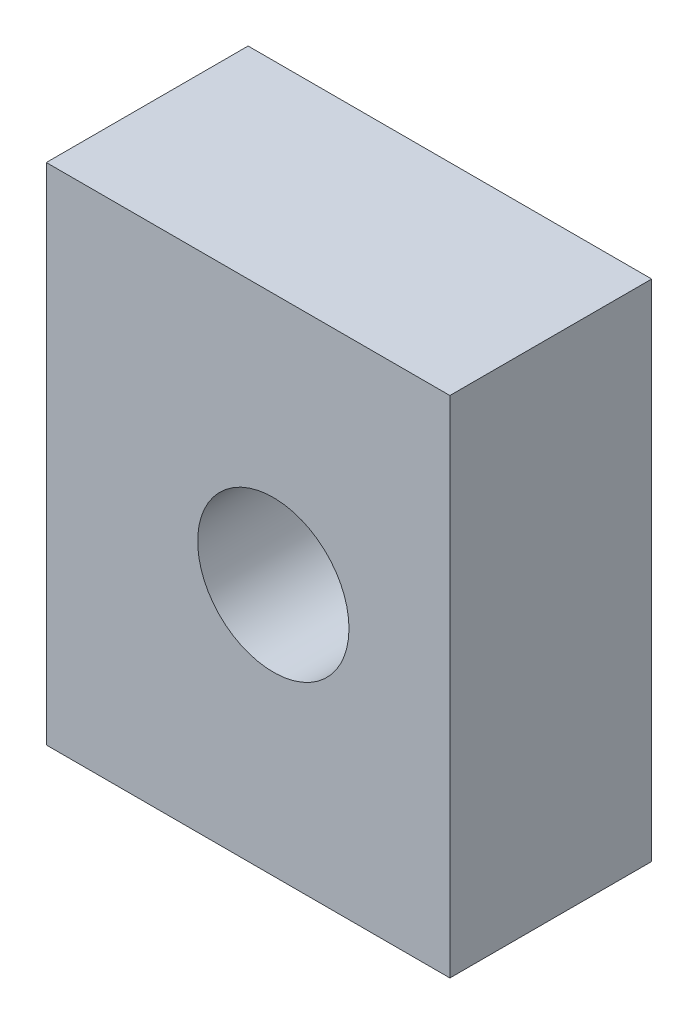
ISO-10303-21;
HEADER;
FILE_DESCRIPTION(('STEP AP214'),'2;1');
FILE_NAME('part.step','',(''),(''),'','','');
FILE_SCHEMA(('AUTOMOTIVE_DESIGN { 1 0 10303 214 1 1 1 1 }'));
ENDSEC;
DATA;
#1=APPLICATION_CONTEXT('core data for automotive mechanical design processes');
#2=APPLICATION_PROTOCOL_DEFINITION('international standard','automotive_design',2000,#1);
#3=PRODUCT_CONTEXT('',#1,'mechanical');
#4=PRODUCT('Part','Part','',(#3));
#5=PRODUCT_RELATED_PRODUCT_CATEGORY('part','',(#4));
#6=PRODUCT_DEFINITION_FORMATION('','',#4);
#7=PRODUCT_DEFINITION_CONTEXT('part definition',#1,'design');
#8=PRODUCT_DEFINITION('design','',#6,#7);
#9=PRODUCT_DEFINITION_SHAPE('','',#8);
#10=(LENGTH_UNIT() NAMED_UNIT(*) SI_UNIT(.MILLI.,.METRE.));
#11=(NAMED_UNIT(*) PLANE_ANGLE_UNIT() SI_UNIT($,.RADIAN.));
#12=(NAMED_UNIT(*) SI_UNIT($,.STERADIAN.) SOLID_ANGLE_UNIT());
#13=UNCERTAINTY_MEASURE_WITH_UNIT(LENGTH_MEASURE(1.E-05),#10,'distance_accuracy_value','');
#14=(GEOMETRIC_REPRESENTATION_CONTEXT(3) GLOBAL_UNCERTAINTY_ASSIGNED_CONTEXT((#13)) GLOBAL_UNIT_ASSIGNED_CONTEXT((#10,
#11,#12)) REPRESENTATION_CONTEXT('',''));
#15=CARTESIAN_POINT('',(0.,0.,0.));
#16=DIRECTION('',(0.,0.,1.));
#17=DIRECTION('',(1.,0.,0.));
#18=AXIS2_PLACEMENT_3D('',#15,#16,#17);
#19=CARTESIAN_POINT('',(0.,0.,4.));
#20=DIRECTION('',(0.,0.,-1.));
#21=DIRECTION('',(-1.,0.,0.));
#22=AXIS2_PLACEMENT_3D('',#19,#20,#21);
#23=PLANE('',#22);
#24=DIRECTION('',(0.,1.,0.));
#25=VECTOR('',#24,1.);
#26=CARTESIAN_POINT('',(7.99999999999996,10.,4.));
#27=LINE('',#26,#25);
#28=CARTESIAN_POINT('',(7.99999999999996,0.,4.));
#29=VERTEX_POINT('',#28);
#30=CARTESIAN_POINT('',(7.99999999999996,10.,4.));
#31=VERTEX_POINT('',#30);
#32=EDGE_CURVE('E84',#29,#31,#27,.T.);
#33=ORIENTED_EDGE('',*,*,#32,.T.);
#34=DIRECTION('',(-1.,0.,0.));
#35=VECTOR('',#34,1.);
#36=CARTESIAN_POINT('',(0.,10.,4.));
#37=LINE('',#36,#35);
#38=CARTESIAN_POINT('',(0.,10.,4.));
#39=VERTEX_POINT('',#38);
#40=EDGE_CURVE('E79',#31,#39,#37,.T.);
#41=ORIENTED_EDGE('',*,*,#40,.T.);
#42=DIRECTION('',(0.,-1.,0.));
#43=VECTOR('',#42,1.);
#44=CARTESIAN_POINT('',(0.,10.,4.));
#45=LINE('',#44,#43);
#46=CARTESIAN_POINT('',(0.,0.,4.));
#47=VERTEX_POINT('',#46);
#48=EDGE_CURVE('E82',#39,#47,#45,.T.);
#49=ORIENTED_EDGE('',*,*,#48,.T.);
#50=DIRECTION('',(1.,0.,0.));
#51=VECTOR('',#50,1.);
#52=CARTESIAN_POINT('',(7.99999999999996,0.,4.));
#53=LINE('',#52,#51);
#54=EDGE_CURVE('E49',#47,#29,#53,.T.);
#55=ORIENTED_EDGE('',*,*,#54,.T.);
#56=EDGE_LOOP('',(#33,#41,#49,#55));
#57=FACE_BOUND('',#56,.T.);
#58=CARTESIAN_POINT('',(4.49999999999998,5.,4.));
#59=DIRECTION('',(0.,0.,1.));
#60=DIRECTION('',(1.,0.,0.));
#61=AXIS2_PLACEMENT_3D('',#58,#59,#60);
#62=CIRCLE('',#61,1.5);
#63=CARTESIAN_POINT('',(5.99999999999998,5.,4.));
#64=VERTEX_POINT('',#63);
#65=EDGE_CURVE('E99',#64,#64,#62,.T.);
#66=ORIENTED_EDGE('',*,*,#65,.F.);
#67=EDGE_LOOP('',(#66));
#68=FACE_BOUND('',#67,.T.);
#69=ADVANCED_FACE('F32',(#57,#68),#23,.F.);
#70=CARTESIAN_POINT('',(0.,0.,0.));
#71=DIRECTION('',(0.,0.,-1.));
#72=DIRECTION('',(-1.,0.,0.));
#73=AXIS2_PLACEMENT_3D('',#70,#71,#72);
#74=PLANE('',#73);
#75=DIRECTION('',(0.,1.,0.));
#76=VECTOR('',#75,1.);
#77=CARTESIAN_POINT('',(7.99999999999996,10.,0.));
#78=LINE('',#77,#76);
#79=CARTESIAN_POINT('',(7.99999999999996,0.,0.));
#80=VERTEX_POINT('',#79);
#81=CARTESIAN_POINT('',(7.99999999999996,10.,0.));
#82=VERTEX_POINT('',#81);
#83=EDGE_CURVE('E96',#80,#82,#78,.T.);
#84=ORIENTED_EDGE('',*,*,#83,.F.);
#85=DIRECTION('',(1.,0.,0.));
#86=VECTOR('',#85,1.);
#87=CARTESIAN_POINT('',(7.99999999999996,0.,0.));
#88=LINE('',#87,#86);
#89=CARTESIAN_POINT('',(0.,0.,0.));
#90=VERTEX_POINT('',#89);
#91=EDGE_CURVE('E72',#90,#80,#88,.T.);
#92=ORIENTED_EDGE('',*,*,#91,.F.);
#93=DIRECTION('',(0.,-1.,0.));
#94=VECTOR('',#93,1.);
#95=CARTESIAN_POINT('',(0.,10.,0.));
#96=LINE('',#95,#94);
#97=CARTESIAN_POINT('',(0.,10.,0.));
#98=VERTEX_POINT('',#97);
#99=EDGE_CURVE('E66',#98,#90,#96,.T.);
#100=ORIENTED_EDGE('',*,*,#99,.F.);
#101=DIRECTION('',(-1.,0.,0.));
#102=VECTOR('',#101,1.);
#103=CARTESIAN_POINT('',(0.,10.,0.));
#104=LINE('',#103,#102);
#105=EDGE_CURVE('E88',#82,#98,#104,.T.);
#106=ORIENTED_EDGE('',*,*,#105,.F.);
#107=EDGE_LOOP('',(#84,#92,#100,#106));
#108=FACE_BOUND('',#107,.T.);
#109=CARTESIAN_POINT('',(4.49999999999998,5.,0.));
#110=DIRECTION('',(0.,0.,1.));
#111=DIRECTION('',(1.,0.,0.));
#112=AXIS2_PLACEMENT_3D('',#109,#110,#111);
#113=CIRCLE('',#112,1.5);
#114=CARTESIAN_POINT('',(5.99999999999998,5.,0.));
#115=VERTEX_POINT('',#114);
#116=EDGE_CURVE('E111',#115,#115,#113,.T.);
#117=ORIENTED_EDGE('',*,*,#116,.T.);
#118=EDGE_LOOP('',(#117));
#119=FACE_BOUND('',#118,.T.);
#120=ADVANCED_FACE('F107',(#108,#119),#74,.T.);
#121=CARTESIAN_POINT('',(7.99999999999996,10.,4.));
#122=DIRECTION('',(-1.,0.,0.));
#123=DIRECTION('',(0.,0.,1.));
#124=AXIS2_PLACEMENT_3D('',#121,#122,#123);
#125=PLANE('',#124);
#126=ORIENTED_EDGE('',*,*,#83,.T.);
#127=DIRECTION('',(0.,0.,-1.));
#128=VECTOR('',#127,1.);
#129=CARTESIAN_POINT('',(7.99999999999996,10.,4.));
#130=LINE('',#129,#128);
#131=EDGE_CURVE('E11',#31,#82,#130,.T.);
#132=ORIENTED_EDGE('',*,*,#131,.F.);
#133=ORIENTED_EDGE('',*,*,#32,.F.);
#134=DIRECTION('',(0.,0.,-1.));
#135=VECTOR('',#134,1.);
#136=CARTESIAN_POINT('',(7.99999999999996,0.,4.));
#137=LINE('',#136,#135);
#138=EDGE_CURVE('E92',#29,#80,#137,.T.);
#139=ORIENTED_EDGE('',*,*,#138,.T.);
#140=EDGE_LOOP('',(#126,#132,#133,#139));
#141=FACE_BOUND('',#140,.T.);
#142=ADVANCED_FACE('F34',(#141),#125,.F.);
#143=CARTESIAN_POINT('',(0.,10.,4.));
#144=DIRECTION('',(0.,-1.,0.));
#145=DIRECTION('',(1.,0.,0.));
#146=AXIS2_PLACEMENT_3D('',#143,#144,#145);
#147=PLANE('',#146);
#148=ORIENTED_EDGE('',*,*,#105,.T.);
#149=DIRECTION('',(0.,0.,-1.));
#150=VECTOR('',#149,1.);
#151=CARTESIAN_POINT('',(0.,10.,4.));
#152=LINE('',#151,#150);
#153=EDGE_CURVE('E41',#39,#98,#152,.T.);
#154=ORIENTED_EDGE('',*,*,#153,.F.);
#155=ORIENTED_EDGE('',*,*,#40,.F.);
#156=ORIENTED_EDGE('',*,*,#131,.T.);
#157=EDGE_LOOP('',(#148,#154,#155,#156));
#158=FACE_BOUND('',#157,.T.);
#159=ADVANCED_FACE('F87',(#158),#147,.F.);
#160=CARTESIAN_POINT('',(0.,10.,4.));
#161=DIRECTION('',(1.,0.,0.));
#162=DIRECTION('',(0.,1.,0.));
#163=AXIS2_PLACEMENT_3D('',#160,#161,#162);
#164=PLANE('',#163);
#165=ORIENTED_EDGE('',*,*,#99,.T.);
#166=DIRECTION('',(0.,0.,-1.));
#167=VECTOR('',#166,1.);
#168=CARTESIAN_POINT('',(0.,0.,4.));
#169=LINE('',#168,#167);
#170=EDGE_CURVE('E89',#47,#90,#169,.T.);
#171=ORIENTED_EDGE('',*,*,#170,.F.);
#172=ORIENTED_EDGE('',*,*,#48,.F.);
#173=ORIENTED_EDGE('',*,*,#153,.T.);
#174=EDGE_LOOP('',(#165,#171,#172,#173));
#175=FACE_BOUND('',#174,.T.);
#176=ADVANCED_FACE('F90',(#175),#164,.F.);
#177=CARTESIAN_POINT('',(7.99999999999996,0.,4.));
#178=DIRECTION('',(0.,1.,0.));
#179=DIRECTION('',(-1.,0.,0.));
#180=AXIS2_PLACEMENT_3D('',#177,#178,#179);
#181=PLANE('',#180);
#182=ORIENTED_EDGE('',*,*,#91,.T.);
#183=ORIENTED_EDGE('',*,*,#138,.F.);
#184=ORIENTED_EDGE('',*,*,#54,.F.);
#185=ORIENTED_EDGE('',*,*,#170,.T.);
#186=EDGE_LOOP('',(#182,#183,#184,#185));
#187=FACE_BOUND('',#186,.T.);
#188=ADVANCED_FACE('F104',(#187),#181,.F.);
#189=CARTESIAN_POINT('',(4.49999999999998,5.,4.));
#190=DIRECTION('',(0.,0.,-1.));
#191=DIRECTION('',(-1.,0.,0.));
#192=AXIS2_PLACEMENT_3D('',#189,#190,#191);
#193=CYLINDRICAL_SURFACE('',#192,1.5);
#194=ORIENTED_EDGE('',*,*,#65,.T.);
#195=EDGE_LOOP('',(#194));
#196=FACE_BOUND('',#195,.T.);
#197=ORIENTED_EDGE('',*,*,#116,.F.);
#198=EDGE_LOOP('',(#197));
#199=FACE_BOUND('',#198,.T.);
#200=ADVANCED_FACE('F117',(#196,#199),#193,.F.);
#201=CLOSED_SHELL('',(#69,#120,#142,#159,#176,#188,#200));
#202=MANIFOLD_SOLID_BREP('B2',#201);
#203=ADVANCED_BREP_SHAPE_REPRESENTATION('',(#18,#202),#14);
#204=SHAPE_DEFINITION_REPRESENTATION(#9,#203);
ENDSEC;
END-ISO-10303-21;
